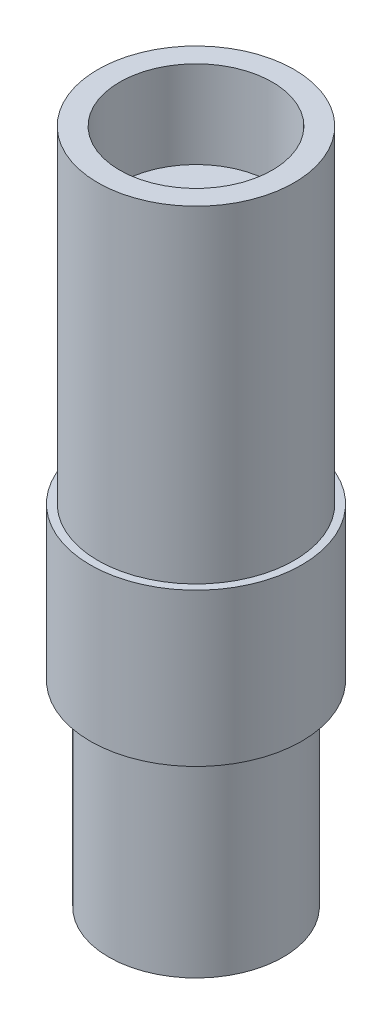
ISO-10303-21;
HEADER;
FILE_DESCRIPTION(('STEP AP214'),'2;1');
FILE_NAME('part.step','',(''),(''),'','','');
FILE_SCHEMA(('AUTOMOTIVE_DESIGN { 1 0 10303 214 1 1 1 1 }'));
ENDSEC;
DATA;
#1=APPLICATION_CONTEXT('core data for automotive mechanical design processes');
#2=APPLICATION_PROTOCOL_DEFINITION('international standard','automotive_design',2000,#1);
#3=PRODUCT_CONTEXT('',#1,'mechanical');
#4=PRODUCT('Part','Part','',(#3));
#5=PRODUCT_RELATED_PRODUCT_CATEGORY('part','',(#4));
#6=PRODUCT_DEFINITION_FORMATION('','',#4);
#7=PRODUCT_DEFINITION_CONTEXT('part definition',#1,'design');
#8=PRODUCT_DEFINITION('design','',#6,#7);
#9=PRODUCT_DEFINITION_SHAPE('','',#8);
#10=(LENGTH_UNIT() NAMED_UNIT(*) SI_UNIT(.MILLI.,.METRE.));
#11=(NAMED_UNIT(*) PLANE_ANGLE_UNIT() SI_UNIT($,.RADIAN.));
#12=(NAMED_UNIT(*) SI_UNIT($,.STERADIAN.) SOLID_ANGLE_UNIT());
#13=UNCERTAINTY_MEASURE_WITH_UNIT(LENGTH_MEASURE(1.E-05),#10,'distance_accuracy_value','');
#14=(GEOMETRIC_REPRESENTATION_CONTEXT(3) GLOBAL_UNCERTAINTY_ASSIGNED_CONTEXT((#13)) GLOBAL_UNIT_ASSIGNED_CONTEXT((#10,
#11,#12)) REPRESENTATION_CONTEXT('',''));
#15=CARTESIAN_POINT('',(0.,0.,0.));
#16=DIRECTION('',(0.,0.,1.));
#17=DIRECTION('',(1.,0.,0.));
#18=AXIS2_PLACEMENT_3D('',#15,#16,#17);
#19=CARTESIAN_POINT('',(0.,-7.,0.));
#20=DIRECTION('',(0.,1.,0.));
#21=DIRECTION('',(0.,0.,1.));
#22=AXIS2_PLACEMENT_3D('',#19,#20,#21);
#23=PLANE('',#22);
#24=CARTESIAN_POINT('',(0.,-7.,0.));
#25=DIRECTION('',(0.,1.,0.));
#26=DIRECTION('',(0.,0.,1.));
#27=AXIS2_PLACEMENT_3D('',#24,#25,#26);
#28=CIRCLE('',#27,4.85);
#29=CARTESIAN_POINT('',(0.,-7.,4.85));
#30=VERTEX_POINT('',#29);
#31=EDGE_CURVE('E54',#30,#30,#28,.T.);
#32=ORIENTED_EDGE('',*,*,#31,.F.);
#33=EDGE_LOOP('',(#32));
#34=FACE_BOUND('',#33,.T.);
#35=CARTESIAN_POINT('',(0.,-7.,0.));
#36=DIRECTION('',(0.,1.,0.));
#37=DIRECTION('',(0.,0.,1.));
#38=AXIS2_PLACEMENT_3D('',#35,#36,#37);
#39=CIRCLE('',#38,4.);
#40=CARTESIAN_POINT('',(0.,-7.,4.));
#41=VERTEX_POINT('',#40);
#42=EDGE_CURVE('E10',#41,#41,#39,.F.);
#43=ORIENTED_EDGE('',*,*,#42,.F.);
#44=EDGE_LOOP('',(#43));
#45=FACE_BOUND('',#44,.T.);
#46=ADVANCED_FACE('F31',(#34,#45),#23,.F.);
#47=CARTESIAN_POINT('',(0.,15.,0.));
#48=DIRECTION('',(0.,-1.,0.));
#49=DIRECTION('',(0.,0.,-1.));
#50=AXIS2_PLACEMENT_3D('',#47,#48,#49);
#51=CYLINDRICAL_SURFACE('',#50,4.5);
#52=CARTESIAN_POINT('',(0.,15.,0.));
#53=DIRECTION('',(0.,1.,0.));
#54=DIRECTION('',(0.,0.,1.));
#55=AXIS2_PLACEMENT_3D('',#52,#53,#54);
#56=CIRCLE('',#55,4.5);
#57=CARTESIAN_POINT('',(0.,15.,4.5));
#58=VERTEX_POINT('',#57);
#59=EDGE_CURVE('E38',#58,#58,#56,.T.);
#60=ORIENTED_EDGE('',*,*,#59,.F.);
#61=EDGE_LOOP('',(#60));
#62=FACE_BOUND('',#61,.T.);
#63=CARTESIAN_POINT('',(0.,0.,0.));
#64=DIRECTION('',(0.,1.,0.));
#65=DIRECTION('',(0.,0.,1.));
#66=AXIS2_PLACEMENT_3D('',#63,#64,#65);
#67=CIRCLE('',#66,4.5);
#68=CARTESIAN_POINT('',(0.,0.,4.5));
#69=VERTEX_POINT('',#68);
#70=EDGE_CURVE('E51',#69,#69,#67,.T.);
#71=ORIENTED_EDGE('',*,*,#70,.T.);
#72=EDGE_LOOP('',(#71));
#73=FACE_BOUND('',#72,.T.);
#74=ADVANCED_FACE('F33',(#62,#73),#51,.T.);
#75=CARTESIAN_POINT('',(0.,15.,0.));
#76=DIRECTION('',(0.,1.,0.));
#77=DIRECTION('',(0.,0.,1.));
#78=AXIS2_PLACEMENT_3D('',#75,#76,#77);
#79=PLANE('',#78);
#80=CARTESIAN_POINT('',(0.,15.,0.));
#81=DIRECTION('',(0.,1.,0.));
#82=DIRECTION('',(0.,0.,1.));
#83=AXIS2_PLACEMENT_3D('',#80,#81,#82);
#84=CIRCLE('',#83,3.49999999999999);
#85=CARTESIAN_POINT('',(0.,15.,3.49999999999999));
#86=VERTEX_POINT('',#85);
#87=EDGE_CURVE('E46',#86,#86,#84,.T.);
#88=ORIENTED_EDGE('',*,*,#87,.F.);
#89=EDGE_LOOP('',(#88));
#90=FACE_BOUND('',#89,.T.);
#91=ORIENTED_EDGE('',*,*,#59,.T.);
#92=EDGE_LOOP('',(#91));
#93=FACE_BOUND('',#92,.T.);
#94=ADVANCED_FACE('F122',(#90,#93),#79,.T.);
#95=CARTESIAN_POINT('',(0.,11.,0.));
#96=DIRECTION('',(0.,-1.,0.));
#97=DIRECTION('',(0.,0.,-1.));
#98=AXIS2_PLACEMENT_3D('',#95,#96,#97);
#99=PLANE('',#98);
#100=CARTESIAN_POINT('',(-1.75,11.,0.));
#101=DIRECTION('',(0.,-1.,0.));
#102=DIRECTION('',(0.,0.,-1.));
#103=AXIS2_PLACEMENT_3D('',#100,#101,#102);
#104=CIRCLE('',#103,0.624999999999996);
#105=CARTESIAN_POINT('',(-1.75,11.,-0.624999999999996));
#106=VERTEX_POINT('',#105);
#107=EDGE_CURVE('E75',#106,#106,#104,.T.);
#108=ORIENTED_EDGE('',*,*,#107,.T.);
#109=EDGE_LOOP('',(#108));
#110=FACE_BOUND('',#109,.T.);
#111=CARTESIAN_POINT('',(1.75,11.,0.));
#112=DIRECTION('',(0.,-1.,0.));
#113=DIRECTION('',(0.,0.,-1.));
#114=AXIS2_PLACEMENT_3D('',#111,#112,#113);
#115=CIRCLE('',#114,0.624999999999996);
#116=CARTESIAN_POINT('',(1.75,11.,-0.624999999999996));
#117=VERTEX_POINT('',#116);
#118=EDGE_CURVE('E69',#117,#117,#115,.T.);
#119=ORIENTED_EDGE('',*,*,#118,.T.);
#120=EDGE_LOOP('',(#119));
#121=FACE_BOUND('',#120,.T.);
#122=CARTESIAN_POINT('',(0.,11.,0.));
#123=DIRECTION('',(0.,1.,0.));
#124=DIRECTION('',(0.,0.,1.));
#125=AXIS2_PLACEMENT_3D('',#122,#123,#124);
#126=CIRCLE('',#125,3.49999999999999);
#127=CARTESIAN_POINT('',(0.,11.,3.49999999999999));
#128=VERTEX_POINT('',#127);
#129=EDGE_CURVE('E42',#128,#128,#126,.T.);
#130=ORIENTED_EDGE('',*,*,#129,.T.);
#131=EDGE_LOOP('',(#130));
#132=FACE_BOUND('',#131,.T.);
#133=ADVANCED_FACE('F133',(#110,#121,#132),#99,.F.);
#134=CARTESIAN_POINT('',(0.,15.,0.));
#135=DIRECTION('',(0.,1.,0.));
#136=DIRECTION('',(0.,0.,1.));
#137=AXIS2_PLACEMENT_3D('',#134,#135,#136);
#138=CYLINDRICAL_SURFACE('',#137,3.49999999999999);
#139=ORIENTED_EDGE('',*,*,#129,.F.);
#140=EDGE_LOOP('',(#139));
#141=FACE_BOUND('',#140,.T.);
#142=ORIENTED_EDGE('',*,*,#87,.T.);
#143=EDGE_LOOP('',(#142));
#144=FACE_BOUND('',#143,.T.);
#145=ADVANCED_FACE('F128',(#141,#144),#138,.F.);
#146=CARTESIAN_POINT('',(0.,0.,0.));
#147=DIRECTION('',(0.,1.,0.));
#148=DIRECTION('',(0.,0.,1.));
#149=AXIS2_PLACEMENT_3D('',#146,#147,#148);
#150=PLANE('',#149);
#151=CARTESIAN_POINT('',(0.,0.,0.));
#152=DIRECTION('',(0.,1.,0.));
#153=DIRECTION('',(0.,0.,1.));
#154=AXIS2_PLACEMENT_3D('',#151,#152,#153);
#155=CIRCLE('',#154,4.85);
#156=CARTESIAN_POINT('',(0.,0.,4.85));
#157=VERTEX_POINT('',#156);
#158=EDGE_CURVE('E55',#157,#157,#155,.T.);
#159=ORIENTED_EDGE('',*,*,#158,.T.);
#160=EDGE_LOOP('',(#159));
#161=FACE_BOUND('',#160,.T.);
#162=ORIENTED_EDGE('',*,*,#70,.F.);
#163=EDGE_LOOP('',(#162));
#164=FACE_BOUND('',#163,.T.);
#165=ADVANCED_FACE('F113',(#161,#164),#150,.T.);
#166=CARTESIAN_POINT('',(0.,-7.,0.));
#167=DIRECTION('',(0.,1.,0.));
#168=DIRECTION('',(0.,0.,1.));
#169=AXIS2_PLACEMENT_3D('',#166,#167,#168);
#170=CYLINDRICAL_SURFACE('',#169,4.85);
#171=ORIENTED_EDGE('',*,*,#31,.T.);
#172=EDGE_LOOP('',(#171));
#173=FACE_BOUND('',#172,.T.);
#174=ORIENTED_EDGE('',*,*,#158,.F.);
#175=EDGE_LOOP('',(#174));
#176=FACE_BOUND('',#175,.T.);
#177=ADVANCED_FACE('F108',(#173,#176),#170,.T.);
#178=CARTESIAN_POINT('',(0.,-16.,0.));
#179=DIRECTION('',(0.,1.,0.));
#180=DIRECTION('',(0.,0.,1.));
#181=AXIS2_PLACEMENT_3D('',#178,#179,#180);
#182=CYLINDRICAL_SURFACE('',#181,4.);
#183=CARTESIAN_POINT('',(0.,-16.,0.));
#184=DIRECTION('',(0.,-1.,0.));
#185=DIRECTION('',(0.,0.,-1.));
#186=AXIS2_PLACEMENT_3D('',#183,#184,#185);
#187=CIRCLE('',#186,4.);
#188=CARTESIAN_POINT('',(0.,-16.,-4.));
#189=VERTEX_POINT('',#188);
#190=EDGE_CURVE('E58',#189,#189,#187,.T.);
#191=ORIENTED_EDGE('',*,*,#190,.F.);
#192=EDGE_LOOP('',(#191));
#193=FACE_BOUND('',#192,.T.);
#194=ORIENTED_EDGE('',*,*,#42,.T.);
#195=EDGE_LOOP('',(#194));
#196=FACE_BOUND('',#195,.T.);
#197=ADVANCED_FACE('F103',(#193,#196),#182,.T.);
#198=CARTESIAN_POINT('',(0.,-16.,0.));
#199=DIRECTION('',(0.,-1.,0.));
#200=DIRECTION('',(0.,0.,-1.));
#201=AXIS2_PLACEMENT_3D('',#198,#199,#200);
#202=PLANE('',#201);
#203=CARTESIAN_POINT('',(0.,-16.,0.));
#204=DIRECTION('',(0.,-1.,0.));
#205=DIRECTION('',(0.,0.,-1.));
#206=AXIS2_PLACEMENT_3D('',#203,#204,#205);
#207=CIRCLE('',#206,3.);
#208=CARTESIAN_POINT('',(0.,-16.,-3.));
#209=VERTEX_POINT('',#208);
#210=EDGE_CURVE('E66',#209,#209,#207,.T.);
#211=ORIENTED_EDGE('',*,*,#210,.F.);
#212=EDGE_LOOP('',(#211));
#213=FACE_BOUND('',#212,.T.);
#214=ORIENTED_EDGE('',*,*,#190,.T.);
#215=EDGE_LOOP('',(#214));
#216=FACE_BOUND('',#215,.T.);
#217=ADVANCED_FACE('F89',(#213,#216),#202,.T.);
#218=CARTESIAN_POINT('',(0.,-1.,0.));
#219=DIRECTION('',(0.,1.,0.));
#220=DIRECTION('',(0.,0.,1.));
#221=AXIS2_PLACEMENT_3D('',#218,#219,#220);
#222=PLANE('',#221);
#223=CARTESIAN_POINT('',(-1.75,-1.,0.));
#224=DIRECTION('',(0.,-1.,0.));
#225=DIRECTION('',(0.,0.,-1.));
#226=AXIS2_PLACEMENT_3D('',#223,#224,#225);
#227=CIRCLE('',#226,0.624999999999998);
#228=CARTESIAN_POINT('',(-1.75,-1.,-0.624999999999998));
#229=VERTEX_POINT('',#228);
#230=EDGE_CURVE('E78',#229,#229,#227,.T.);
#231=ORIENTED_EDGE('',*,*,#230,.F.);
#232=EDGE_LOOP('',(#231));
#233=FACE_BOUND('',#232,.T.);
#234=CARTESIAN_POINT('',(1.75,-1.,0.));
#235=DIRECTION('',(0.,-1.,0.));
#236=DIRECTION('',(0.,0.,-1.));
#237=AXIS2_PLACEMENT_3D('',#234,#235,#236);
#238=CIRCLE('',#237,0.624999999999998);
#239=CARTESIAN_POINT('',(1.75,-1.,-0.624999999999998));
#240=VERTEX_POINT('',#239);
#241=EDGE_CURVE('E72',#240,#240,#238,.T.);
#242=ORIENTED_EDGE('',*,*,#241,.F.);
#243=EDGE_LOOP('',(#242));
#244=FACE_BOUND('',#243,.T.);
#245=CARTESIAN_POINT('',(0.,-1.,0.));
#246=DIRECTION('',(0.,-1.,0.));
#247=DIRECTION('',(0.,0.,-1.));
#248=AXIS2_PLACEMENT_3D('',#245,#246,#247);
#249=CIRCLE('',#248,3.);
#250=CARTESIAN_POINT('',(0.,-1.,-3.));
#251=VERTEX_POINT('',#250);
#252=EDGE_CURVE('E63',#251,#251,#249,.T.);
#253=ORIENTED_EDGE('',*,*,#252,.T.);
#254=EDGE_LOOP('',(#253));
#255=FACE_BOUND('',#254,.T.);
#256=ADVANCED_FACE('F85',(#233,#244,#255),#222,.F.);
#257=CARTESIAN_POINT('',(0.,-16.,0.));
#258=DIRECTION('',(0.,-1.,0.));
#259=DIRECTION('',(0.,0.,-1.));
#260=AXIS2_PLACEMENT_3D('',#257,#258,#259);
#261=CYLINDRICAL_SURFACE('',#260,3.);
#262=ORIENTED_EDGE('',*,*,#252,.F.);
#263=EDGE_LOOP('',(#262));
#264=FACE_BOUND('',#263,.T.);
#265=ORIENTED_EDGE('',*,*,#210,.T.);
#266=EDGE_LOOP('',(#265));
#267=FACE_BOUND('',#266,.T.);
#268=ADVANCED_FACE('F88',(#264,#267),#261,.F.);
#269=CARTESIAN_POINT('',(1.75,-1.,0.));
#270=DIRECTION('',(0.,-1.,0.));
#271=DIRECTION('',(0.,0.,-1.));
#272=AXIS2_PLACEMENT_3D('',#269,#270,#271);
#273=CYLINDRICAL_SURFACE('',#272,0.624999999999996);
#274=ORIENTED_EDGE('',*,*,#241,.T.);
#275=EDGE_LOOP('',(#274));
#276=FACE_BOUND('',#275,.T.);
#277=ORIENTED_EDGE('',*,*,#118,.F.);
#278=EDGE_LOOP('',(#277));
#279=FACE_BOUND('',#278,.T.);
#280=ADVANCED_FACE('F97',(#276,#279),#273,.F.);
#281=CARTESIAN_POINT('',(-1.75,-1.,0.));
#282=DIRECTION('',(0.,-1.,0.));
#283=DIRECTION('',(0.,0.,-1.));
#284=AXIS2_PLACEMENT_3D('',#281,#282,#283);
#285=CYLINDRICAL_SURFACE('',#284,0.624999999999996);
#286=ORIENTED_EDGE('',*,*,#230,.T.);
#287=EDGE_LOOP('',(#286));
#288=FACE_BOUND('',#287,.T.);
#289=ORIENTED_EDGE('',*,*,#107,.F.);
#290=EDGE_LOOP('',(#289));
#291=FACE_BOUND('',#290,.T.);
#292=ADVANCED_FACE('F82',(#288,#291),#285,.F.);
#293=CLOSED_SHELL('',(#46,#74,#94,#133,#145,#165,#177,#197,#217,#256,#268,#280,#292));
#294=MANIFOLD_SOLID_BREP('B2',#293);
#295=ADVANCED_BREP_SHAPE_REPRESENTATION('',(#18,#294),#14);
#296=SHAPE_DEFINITION_REPRESENTATION(#9,#295);
ENDSEC;
END-ISO-10303-21;
